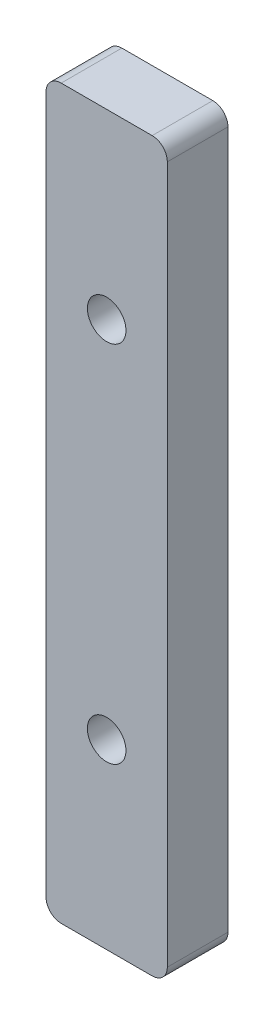
ISO-10303-21;
HEADER;
FILE_DESCRIPTION(('STEP AP214'),'2;1');
FILE_NAME('part.step','',(''),(''),'','','');
FILE_SCHEMA(('AUTOMOTIVE_DESIGN { 1 0 10303 214 1 1 1 1 }'));
ENDSEC;
DATA;
#1=APPLICATION_CONTEXT('core data for automotive mechanical design processes');
#2=APPLICATION_PROTOCOL_DEFINITION('international standard','automotive_design',2000,#1);
#3=PRODUCT_CONTEXT('',#1,'mechanical');
#4=PRODUCT('Part','Part','',(#3));
#5=PRODUCT_RELATED_PRODUCT_CATEGORY('part','',(#4));
#6=PRODUCT_DEFINITION_FORMATION('','',#4);
#7=PRODUCT_DEFINITION_CONTEXT('part definition',#1,'design');
#8=PRODUCT_DEFINITION('design','',#6,#7);
#9=PRODUCT_DEFINITION_SHAPE('','',#8);
#10=(LENGTH_UNIT() NAMED_UNIT(*) SI_UNIT(.MILLI.,.METRE.));
#11=(NAMED_UNIT(*) PLANE_ANGLE_UNIT() SI_UNIT($,.RADIAN.));
#12=(NAMED_UNIT(*) SI_UNIT($,.STERADIAN.) SOLID_ANGLE_UNIT());
#13=UNCERTAINTY_MEASURE_WITH_UNIT(LENGTH_MEASURE(1.E-05),#10,'distance_accuracy_value','');
#14=(GEOMETRIC_REPRESENTATION_CONTEXT(3) GLOBAL_UNCERTAINTY_ASSIGNED_CONTEXT((#13)) GLOBAL_UNIT_ASSIGNED_CONTEXT((#10,
#11,#12)) REPRESENTATION_CONTEXT('',''));
#15=CARTESIAN_POINT('',(0.,0.,0.));
#16=DIRECTION('',(0.,0.,1.));
#17=DIRECTION('',(1.,0.,0.));
#18=AXIS2_PLACEMENT_3D('',#15,#16,#17);
#19=CARTESIAN_POINT('',(-6.35,0.,-6.35));
#20=DIRECTION('',(-1.,0.,0.));
#21=DIRECTION('',(0.,0.,1.));
#22=AXIS2_PLACEMENT_3D('',#19,#20,#21);
#23=PLANE('',#22);
#24=DIRECTION('',(0.,-1.,0.));
#25=VECTOR('',#24,1.);
#26=CARTESIAN_POINT('',(-6.35,0.,0.));
#27=LINE('',#26,#25);
#28=CARTESIAN_POINT('',(-6.35,74.6125,0.));
#29=VERTEX_POINT('',#28);
#30=CARTESIAN_POINT('',(-6.35,1.5875,0.));
#31=VERTEX_POINT('',#30);
#32=EDGE_CURVE('E166',#29,#31,#27,.T.);
#33=ORIENTED_EDGE('',*,*,#32,.F.);
#34=DIRECTION('',(0.,0.,1.));
#35=VECTOR('',#34,1.);
#36=CARTESIAN_POINT('',(-6.35,74.6125,-6.35));
#37=LINE('',#36,#35);
#38=CARTESIAN_POINT('',(-6.35,74.6125,-6.35));
#39=VERTEX_POINT('',#38);
#40=EDGE_CURVE('E12',#29,#39,#37,.F.);
#41=ORIENTED_EDGE('',*,*,#40,.T.);
#42=DIRECTION('',(0.,-1.,0.));
#43=VECTOR('',#42,1.);
#44=CARTESIAN_POINT('',(-6.35,0.,-6.35));
#45=LINE('',#44,#43);
#46=CARTESIAN_POINT('',(-6.35,1.5875,-6.35));
#47=VERTEX_POINT('',#46);
#48=EDGE_CURVE('E162',#39,#47,#45,.T.);
#49=ORIENTED_EDGE('',*,*,#48,.T.);
#50=DIRECTION('',(0.,0.,1.));
#51=VECTOR('',#50,1.);
#52=CARTESIAN_POINT('',(-6.35,1.5875,-6.35));
#53=LINE('',#52,#51);
#54=EDGE_CURVE('E49',#47,#31,#53,.T.);
#55=ORIENTED_EDGE('',*,*,#54,.T.);
#56=EDGE_LOOP('',(#33,#41,#49,#55));
#57=FACE_BOUND('',#56,.T.);
#58=ADVANCED_FACE('F41',(#57),#23,.T.);
#59=CARTESIAN_POINT('',(-6.35,76.2,-6.35));
#60=DIRECTION('',(0.,1.,0.));
#61=DIRECTION('',(0.,0.,1.));
#62=AXIS2_PLACEMENT_3D('',#59,#60,#61);
#63=PLANE('',#62);
#64=DIRECTION('',(-1.,0.,0.));
#65=VECTOR('',#64,1.);
#66=CARTESIAN_POINT('',(-6.35,76.2,0.));
#67=LINE('',#66,#65);
#68=CARTESIAN_POINT('',(4.7625,76.2,0.));
#69=VERTEX_POINT('',#68);
#70=CARTESIAN_POINT('',(-4.7625,76.2,0.));
#71=VERTEX_POINT('',#70);
#72=EDGE_CURVE('E126',#69,#71,#67,.T.);
#73=ORIENTED_EDGE('',*,*,#72,.F.);
#74=DIRECTION('',(0.,0.,1.));
#75=VECTOR('',#74,1.);
#76=CARTESIAN_POINT('',(4.7625,76.2,-6.35));
#77=LINE('',#76,#75);
#78=CARTESIAN_POINT('',(4.7625,76.2,-6.35));
#79=VERTEX_POINT('',#78);
#80=EDGE_CURVE('E145',#69,#79,#77,.F.);
#81=ORIENTED_EDGE('',*,*,#80,.T.);
#82=DIRECTION('',(-1.,0.,0.));
#83=VECTOR('',#82,1.);
#84=CARTESIAN_POINT('',(-6.35,76.2,-6.35));
#85=LINE('',#84,#83);
#86=CARTESIAN_POINT('',(-4.7625,76.2,-6.35));
#87=VERTEX_POINT('',#86);
#88=EDGE_CURVE('E129',#79,#87,#85,.T.);
#89=ORIENTED_EDGE('',*,*,#88,.T.);
#90=DIRECTION('',(0.,0.,1.));
#91=VECTOR('',#90,1.);
#92=CARTESIAN_POINT('',(-4.7625,76.2,-6.35));
#93=LINE('',#92,#91);
#94=EDGE_CURVE('E142',#87,#71,#93,.T.);
#95=ORIENTED_EDGE('',*,*,#94,.T.);
#96=EDGE_LOOP('',(#73,#81,#89,#95));
#97=FACE_BOUND('',#96,.T.);
#98=ADVANCED_FACE('F230',(#97),#63,.T.);
#99=CARTESIAN_POINT('',(6.35,0.,-6.35));
#100=DIRECTION('',(1.,0.,0.));
#101=DIRECTION('',(0.,0.,-1.));
#102=AXIS2_PLACEMENT_3D('',#99,#100,#101);
#103=PLANE('',#102);
#104=DIRECTION('',(0.,1.,0.));
#105=VECTOR('',#104,1.);
#106=CARTESIAN_POINT('',(6.35,0.,-6.35));
#107=LINE('',#106,#105);
#108=CARTESIAN_POINT('',(6.35,1.5875,-6.35));
#109=VERTEX_POINT('',#108);
#110=CARTESIAN_POINT('',(6.35,74.6125,-6.35));
#111=VERTEX_POINT('',#110);
#112=EDGE_CURVE('E135',#109,#111,#107,.T.);
#113=ORIENTED_EDGE('',*,*,#112,.T.);
#114=DIRECTION('',(0.,0.,1.));
#115=VECTOR('',#114,1.);
#116=CARTESIAN_POINT('',(6.35,74.6125,-6.35));
#117=LINE('',#116,#115);
#118=CARTESIAN_POINT('',(6.35,74.6125,0.));
#119=VERTEX_POINT('',#118);
#120=EDGE_CURVE('E125',#111,#119,#117,.T.);
#121=ORIENTED_EDGE('',*,*,#120,.T.);
#122=DIRECTION('',(0.,1.,0.));
#123=VECTOR('',#122,1.);
#124=CARTESIAN_POINT('',(6.35,0.,0.));
#125=LINE('',#124,#123);
#126=CARTESIAN_POINT('',(6.35,1.5875,0.));
#127=VERTEX_POINT('',#126);
#128=EDGE_CURVE('E110',#127,#119,#125,.T.);
#129=ORIENTED_EDGE('',*,*,#128,.F.);
#130=DIRECTION('',(0.,0.,1.));
#131=VECTOR('',#130,1.);
#132=CARTESIAN_POINT('',(6.35,1.5875,-6.35));
#133=LINE('',#132,#131);
#134=EDGE_CURVE('E123',#127,#109,#133,.F.);
#135=ORIENTED_EDGE('',*,*,#134,.T.);
#136=EDGE_LOOP('',(#113,#121,#129,#135));
#137=FACE_BOUND('',#136,.T.);
#138=ADVANCED_FACE('F122',(#137),#103,.T.);
#139=CARTESIAN_POINT('',(-6.35,0.,-6.35));
#140=DIRECTION('',(0.,-1.,0.));
#141=DIRECTION('',(0.,0.,-1.));
#142=AXIS2_PLACEMENT_3D('',#139,#140,#141);
#143=PLANE('',#142);
#144=DIRECTION('',(1.,0.,0.));
#145=VECTOR('',#144,1.);
#146=CARTESIAN_POINT('',(-6.35,0.,-6.35));
#147=LINE('',#146,#145);
#148=CARTESIAN_POINT('',(-4.7625,0.,-6.35));
#149=VERTEX_POINT('',#148);
#150=CARTESIAN_POINT('',(4.7625,0.,-6.35));
#151=VERTEX_POINT('',#150);
#152=EDGE_CURVE('E157',#149,#151,#147,.T.);
#153=ORIENTED_EDGE('',*,*,#152,.T.);
#154=DIRECTION('',(0.,0.,1.));
#155=VECTOR('',#154,1.);
#156=CARTESIAN_POINT('',(4.7625,0.,-6.35));
#157=LINE('',#156,#155);
#158=CARTESIAN_POINT('',(4.7625,0.,0.));
#159=VERTEX_POINT('',#158);
#160=EDGE_CURVE('E179',#151,#159,#157,.T.);
#161=ORIENTED_EDGE('',*,*,#160,.T.);
#162=DIRECTION('',(1.,0.,0.));
#163=VECTOR('',#162,1.);
#164=CARTESIAN_POINT('',(-6.35,0.,0.));
#165=LINE('',#164,#163);
#166=CARTESIAN_POINT('',(-4.7625,0.,0.));
#167=VERTEX_POINT('',#166);
#168=EDGE_CURVE('E111',#167,#159,#165,.T.);
#169=ORIENTED_EDGE('',*,*,#168,.F.);
#170=DIRECTION('',(0.,0.,1.));
#171=VECTOR('',#170,1.);
#172=CARTESIAN_POINT('',(-4.7625,0.,-6.35));
#173=LINE('',#172,#171);
#174=EDGE_CURVE('E63',#167,#149,#173,.F.);
#175=ORIENTED_EDGE('',*,*,#174,.T.);
#176=EDGE_LOOP('',(#153,#161,#169,#175));
#177=FACE_BOUND('',#176,.T.);
#178=ADVANCED_FACE('F238',(#177),#143,.T.);
#179=CARTESIAN_POINT('',(-6.35,76.2,-6.35));
#180=DIRECTION('',(0.,0.,-1.));
#181=DIRECTION('',(-1.,0.,0.));
#182=AXIS2_PLACEMENT_3D('',#179,#180,#181);
#183=PLANE('',#182);
#184=CARTESIAN_POINT('',(0.,57.15,-6.35));
#185=DIRECTION('',(0.,0.,-1.));
#186=DIRECTION('',(-1.,0.,0.));
#187=AXIS2_PLACEMENT_3D('',#184,#185,#186);
#188=CIRCLE('',#187,2.0193);
#189=CARTESIAN_POINT('',(-2.0193,57.15,-6.35));
#190=VERTEX_POINT('',#189);
#191=EDGE_CURVE('E198',#190,#190,#188,.T.);
#192=ORIENTED_EDGE('',*,*,#191,.F.);
#193=EDGE_LOOP('',(#192));
#194=FACE_BOUND('',#193,.T.);
#195=CARTESIAN_POINT('',(0.,19.05,-6.35));
#196=DIRECTION('',(0.,0.,-1.));
#197=DIRECTION('',(-1.,0.,0.));
#198=AXIS2_PLACEMENT_3D('',#195,#196,#197);
#199=CIRCLE('',#198,2.0193);
#200=CARTESIAN_POINT('',(-2.0193,19.05,-6.35));
#201=VERTEX_POINT('',#200);
#202=EDGE_CURVE('E191',#201,#201,#199,.T.);
#203=ORIENTED_EDGE('',*,*,#202,.F.);
#204=EDGE_LOOP('',(#203));
#205=FACE_BOUND('',#204,.T.);
#206=ORIENTED_EDGE('',*,*,#88,.F.);
#207=CARTESIAN_POINT('',(4.7625,74.6125,-6.35));
#208=DIRECTION('',(0.,0.,-1.));
#209=DIRECTION('',(-1.,0.,0.));
#210=AXIS2_PLACEMENT_3D('',#207,#208,#209);
#211=CIRCLE('',#210,1.5875);
#212=EDGE_CURVE('E173',#79,#111,#211,.T.);
#213=ORIENTED_EDGE('',*,*,#212,.T.);
#214=ORIENTED_EDGE('',*,*,#112,.F.);
#215=CARTESIAN_POINT('',(4.7625,1.5875,-6.35));
#216=DIRECTION('',(0.,0.,-1.));
#217=DIRECTION('',(-1.,0.,0.));
#218=AXIS2_PLACEMENT_3D('',#215,#216,#217);
#219=CIRCLE('',#218,1.5875);
#220=EDGE_CURVE('E56',#109,#151,#219,.T.);
#221=ORIENTED_EDGE('',*,*,#220,.T.);
#222=ORIENTED_EDGE('',*,*,#152,.F.);
#223=CARTESIAN_POINT('',(-4.7625,1.5875,-6.35));
#224=DIRECTION('',(0.,0.,-1.));
#225=DIRECTION('',(-1.,0.,0.));
#226=AXIS2_PLACEMENT_3D('',#223,#224,#225);
#227=CIRCLE('',#226,1.5875);
#228=EDGE_CURVE('E147',#149,#47,#227,.T.);
#229=ORIENTED_EDGE('',*,*,#228,.T.);
#230=ORIENTED_EDGE('',*,*,#48,.F.);
#231=CARTESIAN_POINT('',(-4.7625,74.6125,-6.35));
#232=DIRECTION('',(0.,0.,-1.));
#233=DIRECTION('',(-1.,0.,0.));
#234=AXIS2_PLACEMENT_3D('',#231,#232,#233);
#235=CIRCLE('',#234,1.5875);
#236=EDGE_CURVE('E151',#39,#87,#235,.T.);
#237=ORIENTED_EDGE('',*,*,#236,.T.);
#238=EDGE_LOOP('',(#206,#213,#214,#221,#222,#229,#230,#237));
#239=FACE_BOUND('',#238,.T.);
#240=ADVANCED_FACE('F216',(#194,#205,#239),#183,.T.);
#241=CARTESIAN_POINT('',(-6.35,76.2,0.));
#242=DIRECTION('',(0.,0.,-1.));
#243=DIRECTION('',(-1.,0.,0.));
#244=AXIS2_PLACEMENT_3D('',#241,#242,#243);
#245=PLANE('',#244);
#246=CARTESIAN_POINT('',(0.,57.15,0.));
#247=DIRECTION('',(0.,0.,1.));
#248=DIRECTION('',(1.,0.,0.));
#249=AXIS2_PLACEMENT_3D('',#246,#247,#248);
#250=CIRCLE('',#249,2.0193);
#251=CARTESIAN_POINT('',(2.0193,57.15,0.));
#252=VERTEX_POINT('',#251);
#253=EDGE_CURVE('E203',#252,#252,#250,.T.);
#254=ORIENTED_EDGE('',*,*,#253,.F.);
#255=EDGE_LOOP('',(#254));
#256=FACE_BOUND('',#255,.T.);
#257=CARTESIAN_POINT('',(0.,19.05,0.));
#258=DIRECTION('',(0.,0.,1.));
#259=DIRECTION('',(1.,0.,0.));
#260=AXIS2_PLACEMENT_3D('',#257,#258,#259);
#261=CIRCLE('',#260,2.0193);
#262=CARTESIAN_POINT('',(2.0193,19.05,0.));
#263=VERTEX_POINT('',#262);
#264=EDGE_CURVE('E193',#263,#263,#261,.T.);
#265=ORIENTED_EDGE('',*,*,#264,.F.);
#266=EDGE_LOOP('',(#265));
#267=FACE_BOUND('',#266,.T.);
#268=ORIENTED_EDGE('',*,*,#128,.T.);
#269=CARTESIAN_POINT('',(4.7625,74.6125,0.));
#270=DIRECTION('',(0.,0.,-1.));
#271=DIRECTION('',(-1.,0.,0.));
#272=AXIS2_PLACEMENT_3D('',#269,#270,#271);
#273=CIRCLE('',#272,1.5875);
#274=EDGE_CURVE('E116',#119,#69,#273,.F.);
#275=ORIENTED_EDGE('',*,*,#274,.T.);
#276=ORIENTED_EDGE('',*,*,#72,.T.);
#277=CARTESIAN_POINT('',(-4.7625,74.6125,0.));
#278=DIRECTION('',(0.,0.,-1.));
#279=DIRECTION('',(-1.,0.,0.));
#280=AXIS2_PLACEMENT_3D('',#277,#278,#279);
#281=CIRCLE('',#280,1.5875);
#282=EDGE_CURVE('E117',#71,#29,#281,.F.);
#283=ORIENTED_EDGE('',*,*,#282,.T.);
#284=ORIENTED_EDGE('',*,*,#32,.T.);
#285=CARTESIAN_POINT('',(-4.7625,1.5875,0.));
#286=DIRECTION('',(0.,0.,-1.));
#287=DIRECTION('',(-1.,0.,0.));
#288=AXIS2_PLACEMENT_3D('',#285,#286,#287);
#289=CIRCLE('',#288,1.5875);
#290=EDGE_CURVE('E131',#31,#167,#289,.F.);
#291=ORIENTED_EDGE('',*,*,#290,.T.);
#292=ORIENTED_EDGE('',*,*,#168,.T.);
#293=CARTESIAN_POINT('',(4.7625,1.5875,0.));
#294=DIRECTION('',(0.,0.,-1.));
#295=DIRECTION('',(-1.,0.,0.));
#296=AXIS2_PLACEMENT_3D('',#293,#294,#295);
#297=CIRCLE('',#296,1.5875);
#298=EDGE_CURVE('E107',#159,#127,#297,.F.);
#299=ORIENTED_EDGE('',*,*,#298,.T.);
#300=EDGE_LOOP('',(#268,#275,#276,#283,#284,#291,#292,#299));
#301=FACE_BOUND('',#300,.T.);
#302=ADVANCED_FACE('F109',(#256,#267,#301),#245,.F.);
#303=CARTESIAN_POINT('',(0.,19.05,0.));
#304=DIRECTION('',(0.,0.,1.));
#305=DIRECTION('',(1.,0.,0.));
#306=AXIS2_PLACEMENT_3D('',#303,#304,#305);
#307=CYLINDRICAL_SURFACE('',#306,2.0193);
#308=ORIENTED_EDGE('',*,*,#202,.T.);
#309=EDGE_LOOP('',(#308));
#310=FACE_BOUND('',#309,.T.);
#311=ORIENTED_EDGE('',*,*,#264,.T.);
#312=EDGE_LOOP('',(#311));
#313=FACE_BOUND('',#312,.T.);
#314=ADVANCED_FACE('F215',(#310,#313),#307,.F.);
#315=CARTESIAN_POINT('',(0.,57.15,0.));
#316=DIRECTION('',(0.,0.,1.));
#317=DIRECTION('',(1.,0.,0.));
#318=AXIS2_PLACEMENT_3D('',#315,#316,#317);
#319=CYLINDRICAL_SURFACE('',#318,2.0193);
#320=ORIENTED_EDGE('',*,*,#191,.T.);
#321=EDGE_LOOP('',(#320));
#322=FACE_BOUND('',#321,.T.);
#323=ORIENTED_EDGE('',*,*,#253,.T.);
#324=EDGE_LOOP('',(#323));
#325=FACE_BOUND('',#324,.T.);
#326=ADVANCED_FACE('F211',(#322,#325),#319,.F.);
#327=CARTESIAN_POINT('',(4.7625,74.6125,-6.35));
#328=DIRECTION('',(0.,0.,1.));
#329=DIRECTION('',(1.,0.,0.));
#330=AXIS2_PLACEMENT_3D('',#327,#328,#329);
#331=CYLINDRICAL_SURFACE('',#330,1.5875);
#332=ORIENTED_EDGE('',*,*,#212,.F.);
#333=ORIENTED_EDGE('',*,*,#80,.F.);
#334=ORIENTED_EDGE('',*,*,#274,.F.);
#335=ORIENTED_EDGE('',*,*,#120,.F.);
#336=EDGE_LOOP('',(#332,#333,#334,#335));
#337=FACE_BOUND('',#336,.T.);
#338=ADVANCED_FACE('F225',(#337),#331,.T.);
#339=CARTESIAN_POINT('',(4.7625,1.5875,-6.35));
#340=DIRECTION('',(0.,0.,1.));
#341=DIRECTION('',(1.,0.,0.));
#342=AXIS2_PLACEMENT_3D('',#339,#340,#341);
#343=CYLINDRICAL_SURFACE('',#342,1.5875);
#344=ORIENTED_EDGE('',*,*,#220,.F.);
#345=ORIENTED_EDGE('',*,*,#134,.F.);
#346=ORIENTED_EDGE('',*,*,#298,.F.);
#347=ORIENTED_EDGE('',*,*,#160,.F.);
#348=EDGE_LOOP('',(#344,#345,#346,#347));
#349=FACE_BOUND('',#348,.T.);
#350=ADVANCED_FACE('F128',(#349),#343,.T.);
#351=CARTESIAN_POINT('',(-4.7625,74.6125,-6.35));
#352=DIRECTION('',(0.,0.,1.));
#353=DIRECTION('',(1.,0.,0.));
#354=AXIS2_PLACEMENT_3D('',#351,#352,#353);
#355=CYLINDRICAL_SURFACE('',#354,1.5875);
#356=ORIENTED_EDGE('',*,*,#236,.F.);
#357=ORIENTED_EDGE('',*,*,#40,.F.);
#358=ORIENTED_EDGE('',*,*,#282,.F.);
#359=ORIENTED_EDGE('',*,*,#94,.F.);
#360=EDGE_LOOP('',(#356,#357,#358,#359));
#361=FACE_BOUND('',#360,.T.);
#362=ADVANCED_FACE('F244',(#361),#355,.T.);
#363=CARTESIAN_POINT('',(-4.7625,1.5875,-6.35));
#364=DIRECTION('',(0.,0.,1.));
#365=DIRECTION('',(1.,0.,0.));
#366=AXIS2_PLACEMENT_3D('',#363,#364,#365);
#367=CYLINDRICAL_SURFACE('',#366,1.5875);
#368=ORIENTED_EDGE('',*,*,#228,.F.);
#369=ORIENTED_EDGE('',*,*,#174,.F.);
#370=ORIENTED_EDGE('',*,*,#290,.F.);
#371=ORIENTED_EDGE('',*,*,#54,.F.);
#372=EDGE_LOOP('',(#368,#369,#370,#371));
#373=FACE_BOUND('',#372,.T.);
#374=ADVANCED_FACE('F43',(#373),#367,.T.);
#375=CLOSED_SHELL('',(#58,#98,#138,#178,#240,#302,#314,#326,#338,#350,#362,#374));
#376=MANIFOLD_SOLID_BREP('B2',#375);
#377=ADVANCED_BREP_SHAPE_REPRESENTATION('',(#18,#376),#14);
#378=SHAPE_DEFINITION_REPRESENTATION(#9,#377);
ENDSEC;
END-ISO-10303-21;
